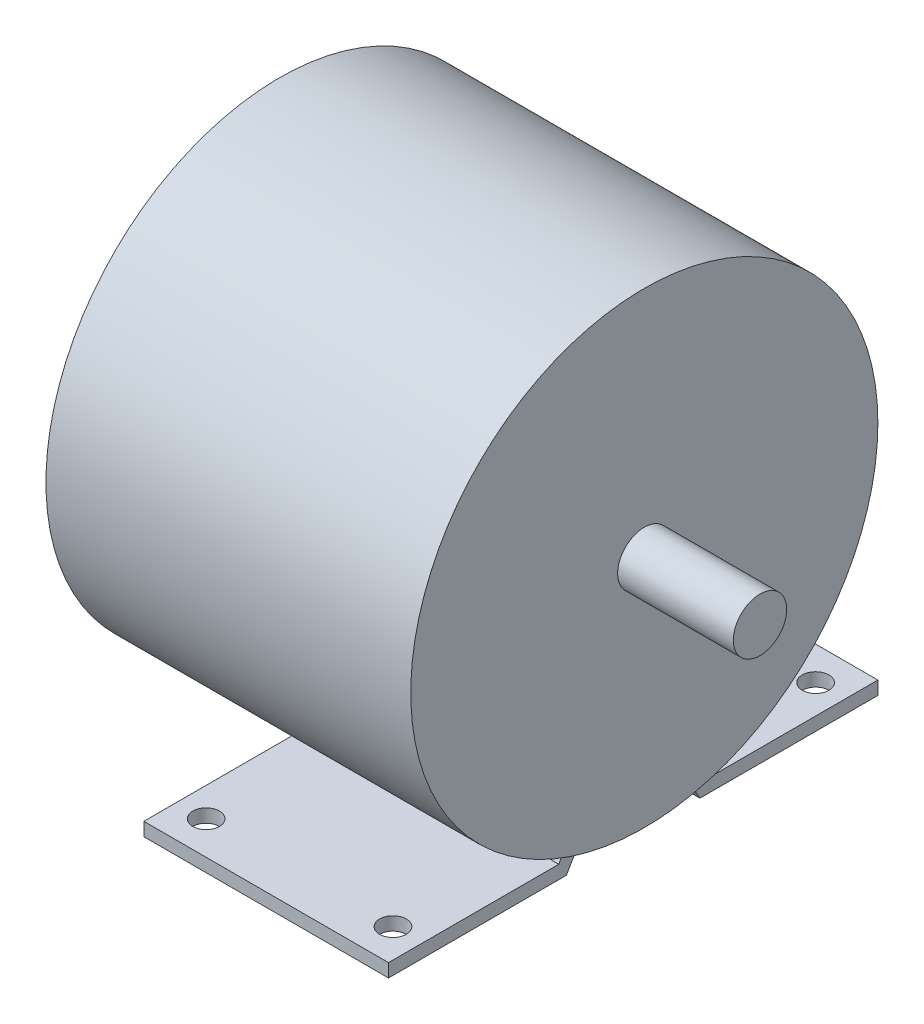
ISO-10303-21;
HEADER;
FILE_DESCRIPTION(('STEP AP214'),'2;1');
FILE_NAME('part.step','',(''),(''),'','','');
FILE_SCHEMA(('AUTOMOTIVE_DESIGN { 1 0 10303 214 1 1 1 1 }'));
ENDSEC;
DATA;
#1=APPLICATION_CONTEXT('core data for automotive mechanical design processes');
#2=APPLICATION_PROTOCOL_DEFINITION('international standard','automotive_design',2000,#1);
#3=PRODUCT_CONTEXT('',#1,'mechanical');
#4=PRODUCT('Part','Part','',(#3));
#5=PRODUCT_RELATED_PRODUCT_CATEGORY('part','',(#4));
#6=PRODUCT_DEFINITION_FORMATION('','',#4);
#7=PRODUCT_DEFINITION_CONTEXT('part definition',#1,'design');
#8=PRODUCT_DEFINITION('design','',#6,#7);
#9=PRODUCT_DEFINITION_SHAPE('','',#8);
#10=(LENGTH_UNIT() NAMED_UNIT(*) SI_UNIT(.MILLI.,.METRE.));
#11=(NAMED_UNIT(*) PLANE_ANGLE_UNIT() SI_UNIT($,.RADIAN.));
#12=(NAMED_UNIT(*) SI_UNIT($,.STERADIAN.) SOLID_ANGLE_UNIT());
#13=UNCERTAINTY_MEASURE_WITH_UNIT(LENGTH_MEASURE(1.E-05),#10,'distance_accuracy_value','');
#14=(GEOMETRIC_REPRESENTATION_CONTEXT(3) GLOBAL_UNCERTAINTY_ASSIGNED_CONTEXT((#13)) GLOBAL_UNIT_ASSIGNED_CONTEXT((#10,
#11,#12)) REPRESENTATION_CONTEXT('',''));
#15=CARTESIAN_POINT('',(0.,0.,0.));
#16=DIRECTION('',(0.,0.,1.));
#17=DIRECTION('',(1.,0.,0.));
#18=AXIS2_PLACEMENT_3D('',#15,#16,#17);
#19=CARTESIAN_POINT('',(82.,0.,0.));
#20=DIRECTION('',(-1.,0.,0.));
#21=DIRECTION('',(0.,0.,1.));
#22=AXIS2_PLACEMENT_3D('',#19,#20,#21);
#23=CYLINDRICAL_SURFACE('',#22,52.5);
#24=DIRECTION('',(1.,0.,0.));
#25=VECTOR('',#24,1.);
#26=CARTESIAN_POINT('',(24.5,-50.1908805682677,-15.3988800820673));
#27=LINE('',#26,#25);
#28=CARTESIAN_POINT('',(24.5,-50.1908805682677,-15.3988800820673));
#29=VERTEX_POINT('',#28);
#30=CARTESIAN_POINT('',(79.5,-50.1908805682677,-15.3988800820672));
#31=VERTEX_POINT('',#30);
#32=EDGE_CURVE('E62',#29,#31,#27,.T.);
#33=ORIENTED_EDGE('',*,*,#32,.F.);
#34=CARTESIAN_POINT('',(24.5,0.,0.));
#35=DIRECTION('',(-1.,0.,0.));
#36=DIRECTION('',(0.,0.,1.));
#37=AXIS2_PLACEMENT_3D('',#34,#35,#36);
#38=CIRCLE('',#37,52.5);
#39=CARTESIAN_POINT('',(24.5,-51.0123974820466,-12.4090814782436));
#40=VERTEX_POINT('',#39);
#41=EDGE_CURVE('E66',#29,#40,#38,.T.);
#42=ORIENTED_EDGE('',*,*,#41,.T.);
#43=DIRECTION('',(1.,0.,0.));
#44=VECTOR('',#43,1.);
#45=CARTESIAN_POINT('',(24.5,-51.0123974820466,-12.4090814782436));
#46=LINE('',#45,#44);
#47=CARTESIAN_POINT('',(79.5,-51.0123974820466,-12.4090814782436));
#48=VERTEX_POINT('',#47);
#49=EDGE_CURVE('E145',#40,#48,#46,.T.);
#50=ORIENTED_EDGE('',*,*,#49,.T.);
#51=CARTESIAN_POINT('',(79.5,0.,0.));
#52=DIRECTION('',(-1.,0.,0.));
#53=DIRECTION('',(0.,0.,1.));
#54=AXIS2_PLACEMENT_3D('',#51,#52,#53);
#55=CIRCLE('',#54,52.5);
#56=EDGE_CURVE('E169',#31,#48,#55,.T.);
#57=ORIENTED_EDGE('',*,*,#56,.F.);
#58=EDGE_LOOP('',(#33,#42,#50,#57));
#59=FACE_BOUND('',#58,.T.);
#60=CARTESIAN_POINT('',(0.,0.,0.));
#61=DIRECTION('',(1.,0.,0.));
#62=DIRECTION('',(0.,0.,-1.));
#63=AXIS2_PLACEMENT_3D('',#60,#61,#62);
#64=CIRCLE('',#63,52.5);
#65=CARTESIAN_POINT('',(0.,0.,-52.5));
#66=VERTEX_POINT('',#65);
#67=EDGE_CURVE('E51',#66,#66,#64,.T.);
#68=ORIENTED_EDGE('',*,*,#67,.T.);
#69=EDGE_LOOP('',(#68));
#70=FACE_BOUND('',#69,.T.);
#71=CARTESIAN_POINT('',(82.,0.,0.));
#72=DIRECTION('',(1.,0.,0.));
#73=DIRECTION('',(0.,0.,-1.));
#74=AXIS2_PLACEMENT_3D('',#71,#72,#73);
#75=CIRCLE('',#74,52.5);
#76=CARTESIAN_POINT('',(82.,0.,-52.5));
#77=VERTEX_POINT('',#76);
#78=EDGE_CURVE('E13',#77,#77,#75,.T.);
#79=ORIENTED_EDGE('',*,*,#78,.F.);
#80=EDGE_LOOP('',(#79));
#81=FACE_BOUND('',#80,.T.);
#82=CARTESIAN_POINT('',(24.5,0.,0.));
#83=DIRECTION('',(-1.,0.,0.));
#84=DIRECTION('',(0.,0.,-1.));
#85=AXIS2_PLACEMENT_3D('',#82,#83,#84);
#86=CIRCLE('',#85,52.5);
#87=CARTESIAN_POINT('',(24.5,-51.0123974820466,12.4090814782436));
#88=VERTEX_POINT('',#87);
#89=CARTESIAN_POINT('',(24.5,-50.1908805682677,15.3988800820672));
#90=VERTEX_POINT('',#89);
#91=EDGE_CURVE('E207',#88,#90,#86,.T.);
#92=ORIENTED_EDGE('',*,*,#91,.T.);
#93=DIRECTION('',(1.,0.,0.));
#94=VECTOR('',#93,1.);
#95=CARTESIAN_POINT('',(24.5,-50.1908805682677,15.3988800820672));
#96=LINE('',#95,#94);
#97=CARTESIAN_POINT('',(79.5,-50.1908805682677,15.3988800820672));
#98=VERTEX_POINT('',#97);
#99=EDGE_CURVE('E226',#90,#98,#96,.T.);
#100=ORIENTED_EDGE('',*,*,#99,.T.);
#101=CARTESIAN_POINT('',(79.5,0.,0.));
#102=DIRECTION('',(-1.,0.,0.));
#103=DIRECTION('',(0.,0.,-1.));
#104=AXIS2_PLACEMENT_3D('',#101,#102,#103);
#105=CIRCLE('',#104,52.5);
#106=CARTESIAN_POINT('',(79.5,-51.0123974820466,12.4090814782436));
#107=VERTEX_POINT('',#106);
#108=EDGE_CURVE('E196',#107,#98,#105,.T.);
#109=ORIENTED_EDGE('',*,*,#108,.F.);
#110=DIRECTION('',(1.,0.,0.));
#111=VECTOR('',#110,1.);
#112=CARTESIAN_POINT('',(24.5,-51.0123974820466,12.4090814782436));
#113=LINE('',#112,#111);
#114=EDGE_CURVE('E230',#88,#107,#113,.T.);
#115=ORIENTED_EDGE('',*,*,#114,.F.);
#116=EDGE_LOOP('',(#92,#100,#109,#115));
#117=FACE_BOUND('',#116,.T.);
#118=ADVANCED_FACE('F48',(#59,#70,#81,#117),#23,.T.);
#119=CARTESIAN_POINT('',(82.,0.,0.));
#120=DIRECTION('',(1.,0.,0.));
#121=DIRECTION('',(0.,0.,-1.));
#122=AXIS2_PLACEMENT_3D('',#119,#120,#121);
#123=PLANE('',#122);
#124=CARTESIAN_POINT('',(82.,0.,0.));
#125=DIRECTION('',(1.,0.,0.));
#126=DIRECTION('',(0.,0.,-1.));
#127=AXIS2_PLACEMENT_3D('',#124,#125,#126);
#128=CIRCLE('',#127,6.);
#129=CARTESIAN_POINT('',(82.,0.,6.));
#130=VERTEX_POINT('',#129);
#131=EDGE_CURVE('E229',#130,#130,#128,.T.);
#132=ORIENTED_EDGE('',*,*,#131,.F.);
#133=EDGE_LOOP('',(#132));
#134=FACE_BOUND('',#133,.T.);
#135=ORIENTED_EDGE('',*,*,#78,.T.);
#136=EDGE_LOOP('',(#135));
#137=FACE_BOUND('',#136,.T.);
#138=ADVANCED_FACE('F248',(#134,#137),#123,.T.);
#139=CARTESIAN_POINT('',(0.,0.,0.));
#140=DIRECTION('',(1.,0.,0.));
#141=DIRECTION('',(0.,0.,-1.));
#142=AXIS2_PLACEMENT_3D('',#139,#140,#141);
#143=PLANE('',#142);
#144=ORIENTED_EDGE('',*,*,#67,.F.);
#145=EDGE_LOOP('',(#144));
#146=FACE_BOUND('',#145,.T.);
#147=ADVANCED_FACE('F251',(#146),#143,.F.);
#148=CARTESIAN_POINT('',(108.,0.,0.));
#149=DIRECTION('',(-1.,0.,0.));
#150=DIRECTION('',(0.,0.,1.));
#151=AXIS2_PLACEMENT_3D('',#148,#149,#150);
#152=CYLINDRICAL_SURFACE('',#151,6.);
#153=CARTESIAN_POINT('',(108.,0.,0.));
#154=DIRECTION('',(1.,0.,0.));
#155=DIRECTION('',(0.,0.,-1.));
#156=AXIS2_PLACEMENT_3D('',#153,#154,#155);
#157=CIRCLE('',#156,6.);
#158=CARTESIAN_POINT('',(108.,0.,6.));
#159=VERTEX_POINT('',#158);
#160=EDGE_CURVE('E240',#159,#159,#157,.T.);
#161=CARTESIAN_POINT('',(108.,0.,6.));
#162=CARTESIAN_POINT('',(107.729166666667,0.,6.));
#163=CARTESIAN_POINT('',(107.458333333333,0.,6.));
#164=CARTESIAN_POINT('',(106.916666666667,0.,6.));
#165=CARTESIAN_POINT('',(106.645833333333,0.,6.));
#166=CARTESIAN_POINT('',(106.104166666667,0.,6.));
#167=CARTESIAN_POINT('',(105.833333333333,0.,6.));
#168=CARTESIAN_POINT('',(105.291666666667,0.,6.));
#169=CARTESIAN_POINT('',(105.020833333333,0.,6.));
#170=CARTESIAN_POINT('',(104.479166666667,0.,6.));
#171=CARTESIAN_POINT('',(104.208333333333,0.,6.));
#172=CARTESIAN_POINT('',(103.666666666667,0.,6.));
#173=CARTESIAN_POINT('',(103.395833333333,0.,6.));
#174=CARTESIAN_POINT('',(102.854166666667,0.,6.));
#175=CARTESIAN_POINT('',(102.583333333333,0.,6.));
#176=CARTESIAN_POINT('',(102.041666666667,0.,6.));
#177=CARTESIAN_POINT('',(101.770833333333,0.,6.));
#178=CARTESIAN_POINT('',(101.229166666667,0.,6.));
#179=CARTESIAN_POINT('',(100.958333333333,0.,6.));
#180=CARTESIAN_POINT('',(100.416666666667,0.,6.));
#181=CARTESIAN_POINT('',(100.145833333333,0.,6.));
#182=CARTESIAN_POINT('',(99.6041666666667,0.,6.));
#183=CARTESIAN_POINT('',(99.3333333333333,0.,6.));
#184=CARTESIAN_POINT('',(98.7916666666667,0.,6.));
#185=CARTESIAN_POINT('',(98.5208333333333,0.,6.));
#186=CARTESIAN_POINT('',(97.9791666666667,0.,6.));
#187=CARTESIAN_POINT('',(97.7083333333333,0.,6.));
#188=CARTESIAN_POINT('',(97.1666666666667,0.,6.));
#189=CARTESIAN_POINT('',(96.8958333333333,0.,6.));
#190=CARTESIAN_POINT('',(96.3541666666667,0.,6.));
#191=CARTESIAN_POINT('',(96.0833333333333,0.,6.));
#192=CARTESIAN_POINT('',(95.5416666666667,0.,6.));
#193=CARTESIAN_POINT('',(95.2708333333333,0.,6.));
#194=CARTESIAN_POINT('',(94.7291666666667,0.,6.));
#195=CARTESIAN_POINT('',(94.4583333333333,0.,6.));
#196=CARTESIAN_POINT('',(93.9166666666667,0.,6.));
#197=CARTESIAN_POINT('',(93.6458333333333,0.,6.));
#198=CARTESIAN_POINT('',(93.1041666666667,0.,6.));
#199=CARTESIAN_POINT('',(92.8333333333333,0.,6.));
#200=CARTESIAN_POINT('',(92.2916666666667,0.,6.));
#201=CARTESIAN_POINT('',(92.0208333333333,0.,6.));
#202=CARTESIAN_POINT('',(91.4791666666667,0.,6.));
#203=CARTESIAN_POINT('',(91.2083333333333,0.,6.));
#204=CARTESIAN_POINT('',(90.6666666666667,0.,6.));
#205=CARTESIAN_POINT('',(90.3958333333333,0.,6.));
#206=CARTESIAN_POINT('',(89.8541666666667,0.,6.));
#207=CARTESIAN_POINT('',(89.5833333333333,0.,6.));
#208=CARTESIAN_POINT('',(89.0416666666667,0.,6.));
#209=CARTESIAN_POINT('',(88.7708333333333,0.,6.));
#210=CARTESIAN_POINT('',(88.2291666666667,0.,6.));
#211=CARTESIAN_POINT('',(87.9583333333333,0.,6.));
#212=CARTESIAN_POINT('',(87.4166666666667,0.,6.));
#213=CARTESIAN_POINT('',(87.1458333333333,0.,6.));
#214=CARTESIAN_POINT('',(86.6041666666667,0.,6.));
#215=CARTESIAN_POINT('',(86.3333333333333,0.,6.));
#216=CARTESIAN_POINT('',(85.7916666666667,0.,6.));
#217=CARTESIAN_POINT('',(85.5208333333333,0.,6.));
#218=CARTESIAN_POINT('',(84.9791666666667,0.,6.));
#219=CARTESIAN_POINT('',(84.7083333333333,0.,6.));
#220=CARTESIAN_POINT('',(84.1666666666667,0.,6.));
#221=CARTESIAN_POINT('',(83.8958333333333,0.,6.));
#222=CARTESIAN_POINT('',(83.3541666666667,0.,6.));
#223=CARTESIAN_POINT('',(83.0833333333333,0.,6.));
#224=CARTESIAN_POINT('',(82.5416666666667,0.,6.));
#225=CARTESIAN_POINT('',(82.2708333333333,0.,6.));
#226=CARTESIAN_POINT('',(82.,0.,6.));
#227=B_SPLINE_CURVE_WITH_KNOTS('',3,(#161,#162,#163,#164,#165,#166,#167,#168,#169,#170,#171,
#172,#173,#174,#175,#176,#177,#178,#179,#180,#181,#182,#183,#184,#185,#186,#187,#188,#189,#190,
#191,#192,#193,#194,#195,#196,#197,#198,#199,#200,#201,#202,#203,#204,#205,#206,#207,#208,#209,
#210,#211,#212,#213,#214,#215,#216,#217,#218,#219,#220,#221,#222,#223,#224,#225,#226),
.UNSPECIFIED.,.F.,.F.,(4,2,2,2,2,2,2,2,2,2,2,2,2,2,2,2,2,2,2,2,2,2,2,2,2,2,2,2,2,2,2,2,4),(0.,
0.812500000000008,1.625,2.43750000000001,3.25,4.06250000000001,4.875,5.6875,6.50000000000001,
7.3125,8.12500000000001,8.9375,9.75000000000001,10.5625,11.375,12.1875,13.,13.8125,14.625,
15.4375,16.25,17.0625,17.875,18.6875,19.5,20.3125,21.125,21.9375,22.75,23.5625,24.375,25.1875,
26.),.UNSPECIFIED.);
#228=EDGE_CURVE('BSEAM246',#159,#130,#227,.T.);
#229=ORIENTED_EDGE('',*,*,#160,.F.);
#230=ORIENTED_EDGE('',*,*,#131,.T.);
#231=ORIENTED_EDGE('',*,*,#228,.T.);
#232=ORIENTED_EDGE('',*,*,#228,.F.);
#233=EDGE_LOOP('',(#229,#231,#230,#232));
#234=FACE_BOUND('',#233,.T.);
#235=ADVANCED_FACE('F246',(#234),#152,.T.);
#236=CARTESIAN_POINT('',(108.,0.,0.));
#237=DIRECTION('',(1.,0.,0.));
#238=DIRECTION('',(0.,0.,-1.));
#239=AXIS2_PLACEMENT_3D('',#236,#237,#238);
#240=PLANE('',#239);
#241=ORIENTED_EDGE('',*,*,#160,.T.);
#242=EDGE_LOOP('',(#241));
#243=FACE_BOUND('',#242,.T.);
#244=ADVANCED_FACE('F298',(#243),#240,.T.);
#245=CARTESIAN_POINT('',(24.5,-52.5,16.7320508075689));
#246=DIRECTION('',(0.,0.5,0.866025403784439));
#247=DIRECTION('',(0.,-0.866025403784439,0.5));
#248=AXIS2_PLACEMENT_3D('',#245,#246,#247);
#249=PLANE('',#248);
#250=DIRECTION('',(0.,-0.866025403784438,0.5));
#251=VECTOR('',#250,1.);
#252=CARTESIAN_POINT('',(79.5,-52.5,16.7320508075689));
#253=LINE('',#252,#251);
#254=CARTESIAN_POINT('',(79.5,-52.5,16.7320508075689));
#255=VERTEX_POINT('',#254);
#256=EDGE_CURVE('E185',#98,#255,#253,.T.);
#257=ORIENTED_EDGE('',*,*,#256,.F.);
#258=ORIENTED_EDGE('',*,*,#99,.F.);
#259=DIRECTION('',(0.,-0.866025403784438,0.5));
#260=VECTOR('',#259,1.);
#261=CARTESIAN_POINT('',(24.5,-52.5,16.7320508075689));
#262=LINE('',#261,#260);
#263=CARTESIAN_POINT('',(24.5,-52.5,16.7320508075689));
#264=VERTEX_POINT('',#263);
#265=EDGE_CURVE('E192',#90,#264,#262,.T.);
#266=ORIENTED_EDGE('',*,*,#265,.T.);
#267=DIRECTION('',(1.,0.,0.));
#268=VECTOR('',#267,1.);
#269=CARTESIAN_POINT('',(24.5,-52.5,16.7320508075689));
#270=LINE('',#269,#268);
#271=EDGE_CURVE('E210',#264,#255,#270,.T.);
#272=ORIENTED_EDGE('',*,*,#271,.T.);
#273=EDGE_LOOP('',(#257,#258,#266,#272));
#274=FACE_BOUND('',#273,.T.);
#275=ADVANCED_FACE('F268',(#274),#249,.T.);
#276=CARTESIAN_POINT('',(24.5,-55.5,15.));
#277=DIRECTION('',(0.,-0.499999999999998,-0.86602540378444));
#278=DIRECTION('',(0.,0.86602540378444,-0.499999999999998));
#279=AXIS2_PLACEMENT_3D('',#276,#277,#278);
#280=PLANE('',#279);
#281=DIRECTION('',(0.,0.86602540378444,-0.499999999999998));
#282=VECTOR('',#281,1.);
#283=CARTESIAN_POINT('',(79.5,-55.5,15.));
#284=LINE('',#283,#282);
#285=CARTESIAN_POINT('',(79.5,-55.5,15.));
#286=VERTEX_POINT('',#285);
#287=EDGE_CURVE('E222',#286,#107,#284,.T.);
#288=ORIENTED_EDGE('',*,*,#287,.F.);
#289=DIRECTION('',(1.,0.,0.));
#290=VECTOR('',#289,1.);
#291=CARTESIAN_POINT('',(24.5,-55.5,15.));
#292=LINE('',#291,#290);
#293=CARTESIAN_POINT('',(24.5,-55.5,15.));
#294=VERTEX_POINT('',#293);
#295=EDGE_CURVE('E233',#294,#286,#292,.T.);
#296=ORIENTED_EDGE('',*,*,#295,.F.);
#297=DIRECTION('',(0.,0.86602540378444,-0.499999999999998));
#298=VECTOR('',#297,1.);
#299=CARTESIAN_POINT('',(24.5,-55.5,15.));
#300=LINE('',#299,#298);
#301=EDGE_CURVE('E205',#294,#88,#300,.T.);
#302=ORIENTED_EDGE('',*,*,#301,.T.);
#303=ORIENTED_EDGE('',*,*,#114,.T.);
#304=EDGE_LOOP('',(#288,#296,#302,#303));
#305=FACE_BOUND('',#304,.T.);
#306=ADVANCED_FACE('F275',(#305),#280,.T.);
#307=CARTESIAN_POINT('',(24.5,-55.5,55.));
#308=DIRECTION('',(0.,-1.,0.));
#309=DIRECTION('',(0.,0.,-1.));
#310=AXIS2_PLACEMENT_3D('',#307,#308,#309);
#311=PLANE('',#310);
#312=CARTESIAN_POINT('',(31.,-55.5,47.4999999999997));
#313=DIRECTION('',(0.,-1.,0.));
#314=DIRECTION('',(0.,0.,-1.));
#315=AXIS2_PLACEMENT_3D('',#312,#313,#314);
#316=CIRCLE('',#315,3.00000000000001);
#317=CARTESIAN_POINT('',(31.,-55.5,44.4999999999997));
#318=VERTEX_POINT('',#317);
#319=EDGE_CURVE('E471',#318,#318,#316,.T.);
#320=ORIENTED_EDGE('',*,*,#319,.F.);
#321=EDGE_LOOP('',(#320));
#322=FACE_BOUND('',#321,.T.);
#323=CARTESIAN_POINT('',(73.,-55.5,47.5));
#324=DIRECTION('',(0.,-1.,0.));
#325=DIRECTION('',(0.,0.,-1.));
#326=AXIS2_PLACEMENT_3D('',#323,#324,#325);
#327=CIRCLE('',#326,3.00000000000001);
#328=CARTESIAN_POINT('',(73.,-55.5,44.5));
#329=VERTEX_POINT('',#328);
#330=EDGE_CURVE('E477',#329,#329,#327,.T.);
#331=ORIENTED_EDGE('',*,*,#330,.F.);
#332=EDGE_LOOP('',(#331));
#333=FACE_BOUND('',#332,.T.);
#334=DIRECTION('',(0.,0.,-1.));
#335=VECTOR('',#334,1.);
#336=CARTESIAN_POINT('',(79.5,-55.5,55.));
#337=LINE('',#336,#335);
#338=CARTESIAN_POINT('',(79.5,-55.5,55.));
#339=VERTEX_POINT('',#338);
#340=EDGE_CURVE('E219',#339,#286,#337,.T.);
#341=ORIENTED_EDGE('',*,*,#340,.F.);
#342=DIRECTION('',(1.,0.,0.));
#343=VECTOR('',#342,1.);
#344=CARTESIAN_POINT('',(24.5,-55.5,55.));
#345=LINE('',#344,#343);
#346=CARTESIAN_POINT('',(24.5,-55.5,55.));
#347=VERTEX_POINT('',#346);
#348=EDGE_CURVE('E235',#347,#339,#345,.T.);
#349=ORIENTED_EDGE('',*,*,#348,.F.);
#350=DIRECTION('',(0.,0.,-1.));
#351=VECTOR('',#350,1.);
#352=CARTESIAN_POINT('',(24.5,-55.5,55.));
#353=LINE('',#352,#351);
#354=EDGE_CURVE('E202',#347,#294,#353,.T.);
#355=ORIENTED_EDGE('',*,*,#354,.T.);
#356=ORIENTED_EDGE('',*,*,#295,.T.);
#357=EDGE_LOOP('',(#341,#349,#355,#356));
#358=FACE_BOUND('',#357,.T.);
#359=ADVANCED_FACE('F277',(#322,#333,#358),#311,.T.);
#360=CARTESIAN_POINT('',(24.5,-52.5,55.));
#361=DIRECTION('',(0.,0.,1.));
#362=DIRECTION('',(1.,0.,0.));
#363=AXIS2_PLACEMENT_3D('',#360,#361,#362);
#364=PLANE('',#363);
#365=DIRECTION('',(0.,-1.,0.));
#366=VECTOR('',#365,1.);
#367=CARTESIAN_POINT('',(79.5,-52.5,55.));
#368=LINE('',#367,#366);
#369=CARTESIAN_POINT('',(79.5,-52.5,55.));
#370=VERTEX_POINT('',#369);
#371=EDGE_CURVE('E216',#370,#339,#368,.T.);
#372=ORIENTED_EDGE('',*,*,#371,.F.);
#373=DIRECTION('',(1.,0.,0.));
#374=VECTOR('',#373,1.);
#375=CARTESIAN_POINT('',(24.5,-52.5,55.));
#376=LINE('',#375,#374);
#377=CARTESIAN_POINT('',(24.5,-52.5,55.));
#378=VERTEX_POINT('',#377);
#379=EDGE_CURVE('E237',#378,#370,#376,.T.);
#380=ORIENTED_EDGE('',*,*,#379,.F.);
#381=DIRECTION('',(0.,-1.,0.));
#382=VECTOR('',#381,1.);
#383=CARTESIAN_POINT('',(24.5,-52.5,55.));
#384=LINE('',#383,#382);
#385=EDGE_CURVE('E199',#378,#347,#384,.T.);
#386=ORIENTED_EDGE('',*,*,#385,.T.);
#387=ORIENTED_EDGE('',*,*,#348,.T.);
#388=EDGE_LOOP('',(#372,#380,#386,#387));
#389=FACE_BOUND('',#388,.T.);
#390=ADVANCED_FACE('F280',(#389),#364,.T.);
#391=CARTESIAN_POINT('',(24.5,-52.5,55.));
#392=DIRECTION('',(0.,1.,0.));
#393=DIRECTION('',(0.,0.,1.));
#394=AXIS2_PLACEMENT_3D('',#391,#392,#393);
#395=PLANE('',#394);
#396=CARTESIAN_POINT('',(31.,-52.5,47.4999999999997));
#397=DIRECTION('',(0.,1.,0.));
#398=DIRECTION('',(0.,0.,1.));
#399=AXIS2_PLACEMENT_3D('',#396,#397,#398);
#400=CIRCLE('',#399,3.00000000000001);
#401=CARTESIAN_POINT('',(31.,-52.5,50.4999999999997));
#402=VERTEX_POINT('',#401);
#403=EDGE_CURVE('E479',#402,#402,#400,.F.);
#404=ORIENTED_EDGE('',*,*,#403,.T.);
#405=EDGE_LOOP('',(#404));
#406=FACE_BOUND('',#405,.T.);
#407=CARTESIAN_POINT('',(73.,-52.5,47.5));
#408=DIRECTION('',(0.,1.,0.));
#409=DIRECTION('',(0.,0.,1.));
#410=AXIS2_PLACEMENT_3D('',#407,#408,#409);
#411=CIRCLE('',#410,3.00000000000001);
#412=CARTESIAN_POINT('',(73.,-52.5,50.5));
#413=VERTEX_POINT('',#412);
#414=EDGE_CURVE('E173',#413,#413,#411,.F.);
#415=ORIENTED_EDGE('',*,*,#414,.T.);
#416=EDGE_LOOP('',(#415));
#417=FACE_BOUND('',#416,.T.);
#418=DIRECTION('',(0.,0.,1.));
#419=VECTOR('',#418,1.);
#420=CARTESIAN_POINT('',(79.5,-52.5,55.));
#421=LINE('',#420,#419);
#422=EDGE_CURVE('E213',#255,#370,#421,.T.);
#423=ORIENTED_EDGE('',*,*,#422,.F.);
#424=ORIENTED_EDGE('',*,*,#271,.F.);
#425=DIRECTION('',(0.,0.,1.));
#426=VECTOR('',#425,1.);
#427=CARTESIAN_POINT('',(24.5,-52.5,55.));
#428=LINE('',#427,#426);
#429=EDGE_CURVE('E195',#264,#378,#428,.T.);
#430=ORIENTED_EDGE('',*,*,#429,.T.);
#431=ORIENTED_EDGE('',*,*,#379,.T.);
#432=EDGE_LOOP('',(#423,#424,#430,#431));
#433=FACE_BOUND('',#432,.T.);
#434=ADVANCED_FACE('F282',(#406,#417,#433),#395,.T.);
#435=CARTESIAN_POINT('',(24.5,0.,0.));
#436=DIRECTION('',(1.,0.,0.));
#437=DIRECTION('',(0.,0.,-1.));
#438=AXIS2_PLACEMENT_3D('',#435,#436,#437);
#439=PLANE('',#438);
#440=ORIENTED_EDGE('',*,*,#265,.F.);
#441=ORIENTED_EDGE('',*,*,#91,.F.);
#442=ORIENTED_EDGE('',*,*,#301,.F.);
#443=ORIENTED_EDGE('',*,*,#354,.F.);
#444=ORIENTED_EDGE('',*,*,#385,.F.);
#445=ORIENTED_EDGE('',*,*,#429,.F.);
#446=EDGE_LOOP('',(#440,#441,#442,#443,#444,#445));
#447=FACE_BOUND('',#446,.T.);
#448=ADVANCED_FACE('F263',(#447),#439,.F.);
#449=CARTESIAN_POINT('',(79.5,0.,0.));
#450=DIRECTION('',(1.,0.,0.));
#451=DIRECTION('',(0.,0.,-1.));
#452=AXIS2_PLACEMENT_3D('',#449,#450,#451);
#453=PLANE('',#452);
#454=ORIENTED_EDGE('',*,*,#256,.T.);
#455=ORIENTED_EDGE('',*,*,#422,.T.);
#456=ORIENTED_EDGE('',*,*,#371,.T.);
#457=ORIENTED_EDGE('',*,*,#340,.T.);
#458=ORIENTED_EDGE('',*,*,#287,.T.);
#459=ORIENTED_EDGE('',*,*,#108,.T.);
#460=EDGE_LOOP('',(#454,#455,#456,#457,#458,#459));
#461=FACE_BOUND('',#460,.T.);
#462=ADVANCED_FACE('F271',(#461),#453,.T.);
#463=CARTESIAN_POINT('',(24.5,-52.5,-16.7320508075689));
#464=DIRECTION('',(0.,0.5,-0.866025403784439));
#465=DIRECTION('',(0.,0.866025403784439,0.5));
#466=AXIS2_PLACEMENT_3D('',#463,#464,#465);
#467=PLANE('',#466);
#468=DIRECTION('',(0.,0.866025403784439,0.5));
#469=VECTOR('',#468,1.);
#470=CARTESIAN_POINT('',(79.5,-52.5,-16.7320508075689));
#471=LINE('',#470,#469);
#472=CARTESIAN_POINT('',(79.5,-52.5,-16.7320508075689));
#473=VERTEX_POINT('',#472);
#474=EDGE_CURVE('E158',#473,#31,#471,.T.);
#475=ORIENTED_EDGE('',*,*,#474,.F.);
#476=DIRECTION('',(1.,0.,0.));
#477=VECTOR('',#476,1.);
#478=CARTESIAN_POINT('',(24.5,-52.5,-16.7320508075689));
#479=LINE('',#478,#477);
#480=CARTESIAN_POINT('',(24.5,-52.5,-16.7320508075689));
#481=VERTEX_POINT('',#480);
#482=EDGE_CURVE('E186',#481,#473,#479,.T.);
#483=ORIENTED_EDGE('',*,*,#482,.F.);
#484=DIRECTION('',(0.,0.866025403784439,0.5));
#485=VECTOR('',#484,1.);
#486=CARTESIAN_POINT('',(24.5,-52.5,-16.7320508075689));
#487=LINE('',#486,#485);
#488=EDGE_CURVE('E166',#481,#29,#487,.T.);
#489=ORIENTED_EDGE('',*,*,#488,.T.);
#490=ORIENTED_EDGE('',*,*,#32,.T.);
#491=EDGE_LOOP('',(#475,#483,#489,#490));
#492=FACE_BOUND('',#491,.T.);
#493=ADVANCED_FACE('F359',(#492),#467,.T.);
#494=CARTESIAN_POINT('',(24.5,-52.5,-55.));
#495=DIRECTION('',(0.,1.,0.));
#496=DIRECTION('',(0.,0.,1.));
#497=AXIS2_PLACEMENT_3D('',#494,#495,#496);
#498=PLANE('',#497);
#499=CARTESIAN_POINT('',(73.,-52.5,-47.5));
#500=DIRECTION('',(0.,1.,0.));
#501=DIRECTION('',(0.,0.,1.));
#502=AXIS2_PLACEMENT_3D('',#499,#500,#501);
#503=CIRCLE('',#502,3.00000000000001);
#504=CARTESIAN_POINT('',(73.,-52.5,-44.5));
#505=VERTEX_POINT('',#504);
#506=EDGE_CURVE('E474',#505,#505,#503,.F.);
#507=ORIENTED_EDGE('',*,*,#506,.T.);
#508=EDGE_LOOP('',(#507));
#509=FACE_BOUND('',#508,.T.);
#510=CARTESIAN_POINT('',(31.,-52.5,-47.5000000000003));
#511=DIRECTION('',(0.,1.,0.));
#512=DIRECTION('',(0.,0.,1.));
#513=AXIS2_PLACEMENT_3D('',#510,#511,#512);
#514=CIRCLE('',#513,3.00000000000001);
#515=CARTESIAN_POINT('',(31.,-52.5,-44.5000000000003));
#516=VERTEX_POINT('',#515);
#517=EDGE_CURVE('E468',#516,#516,#514,.F.);
#518=ORIENTED_EDGE('',*,*,#517,.T.);
#519=EDGE_LOOP('',(#518));
#520=FACE_BOUND('',#519,.T.);
#521=DIRECTION('',(0.,0.,1.));
#522=VECTOR('',#521,1.);
#523=CARTESIAN_POINT('',(79.5,-52.5,-55.));
#524=LINE('',#523,#522);
#525=CARTESIAN_POINT('',(79.5,-52.5,-55.));
#526=VERTEX_POINT('',#525);
#527=EDGE_CURVE('E179',#526,#473,#524,.T.);
#528=ORIENTED_EDGE('',*,*,#527,.F.);
#529=DIRECTION('',(1.,0.,0.));
#530=VECTOR('',#529,1.);
#531=CARTESIAN_POINT('',(24.5,-52.5,-55.));
#532=LINE('',#531,#530);
#533=CARTESIAN_POINT('',(24.5,-52.5,-55.));
#534=VERTEX_POINT('',#533);
#535=EDGE_CURVE('E188',#534,#526,#532,.T.);
#536=ORIENTED_EDGE('',*,*,#535,.F.);
#537=DIRECTION('',(0.,0.,1.));
#538=VECTOR('',#537,1.);
#539=CARTESIAN_POINT('',(24.5,-52.5,-55.));
#540=LINE('',#539,#538);
#541=EDGE_CURVE('E163',#534,#481,#540,.T.);
#542=ORIENTED_EDGE('',*,*,#541,.T.);
#543=ORIENTED_EDGE('',*,*,#482,.T.);
#544=EDGE_LOOP('',(#528,#536,#542,#543));
#545=FACE_BOUND('',#544,.T.);
#546=ADVANCED_FACE('F368',(#509,#520,#545),#498,.T.);
#547=CARTESIAN_POINT('',(24.5,-52.5,-55.));
#548=DIRECTION('',(0.,0.,-1.));
#549=DIRECTION('',(0.,1.,0.));
#550=AXIS2_PLACEMENT_3D('',#547,#548,#549);
#551=PLANE('',#550);
#552=DIRECTION('',(0.,1.,0.));
#553=VECTOR('',#552,1.);
#554=CARTESIAN_POINT('',(79.5,-52.5,-55.));
#555=LINE('',#554,#553);
#556=CARTESIAN_POINT('',(79.5,-55.5,-55.));
#557=VERTEX_POINT('',#556);
#558=EDGE_CURVE('E176',#557,#526,#555,.T.);
#559=ORIENTED_EDGE('',*,*,#558,.F.);
#560=DIRECTION('',(1.,0.,0.));
#561=VECTOR('',#560,1.);
#562=CARTESIAN_POINT('',(24.5,-55.5,-55.));
#563=LINE('',#562,#561);
#564=CARTESIAN_POINT('',(24.5,-55.5,-55.));
#565=VERTEX_POINT('',#564);
#566=EDGE_CURVE('E144',#565,#557,#563,.T.);
#567=ORIENTED_EDGE('',*,*,#566,.F.);
#568=DIRECTION('',(0.,1.,0.));
#569=VECTOR('',#568,1.);
#570=CARTESIAN_POINT('',(24.5,-52.5,-55.));
#571=LINE('',#570,#569);
#572=EDGE_CURVE('E154',#565,#534,#571,.T.);
#573=ORIENTED_EDGE('',*,*,#572,.T.);
#574=ORIENTED_EDGE('',*,*,#535,.T.);
#575=EDGE_LOOP('',(#559,#567,#573,#574));
#576=FACE_BOUND('',#575,.T.);
#577=ADVANCED_FACE('F376',(#576),#551,.T.);
#578=CARTESIAN_POINT('',(24.5,-55.5,-55.));
#579=DIRECTION('',(0.,-1.,0.));
#580=DIRECTION('',(0.,0.,-1.));
#581=AXIS2_PLACEMENT_3D('',#578,#579,#580);
#582=PLANE('',#581);
#583=CARTESIAN_POINT('',(73.,-55.5,-47.5));
#584=DIRECTION('',(0.,-1.,0.));
#585=DIRECTION('',(0.,0.,1.));
#586=AXIS2_PLACEMENT_3D('',#583,#584,#585);
#587=CIRCLE('',#586,3.00000000000001);
#588=CARTESIAN_POINT('',(73.,-55.5,-44.5));
#589=VERTEX_POINT('',#588);
#590=EDGE_CURVE('E463',#589,#589,#587,.T.);
#591=ORIENTED_EDGE('',*,*,#590,.F.);
#592=EDGE_LOOP('',(#591));
#593=FACE_BOUND('',#592,.T.);
#594=CARTESIAN_POINT('',(31.,-55.5,-47.5000000000003));
#595=DIRECTION('',(0.,-1.,0.));
#596=DIRECTION('',(0.,0.,1.));
#597=AXIS2_PLACEMENT_3D('',#594,#595,#596);
#598=CIRCLE('',#597,3.00000000000001);
#599=CARTESIAN_POINT('',(31.,-55.5,-44.5000000000003));
#600=VERTEX_POINT('',#599);
#601=EDGE_CURVE('E466',#600,#600,#598,.T.);
#602=ORIENTED_EDGE('',*,*,#601,.F.);
#603=EDGE_LOOP('',(#602));
#604=FACE_BOUND('',#603,.T.);
#605=DIRECTION('',(0.,0.,-1.));
#606=VECTOR('',#605,1.);
#607=CARTESIAN_POINT('',(79.5,-55.5,-55.));
#608=LINE('',#607,#606);
#609=CARTESIAN_POINT('',(79.5,-55.5,-15.));
#610=VERTEX_POINT('',#609);
#611=EDGE_CURVE('E139',#610,#557,#608,.T.);
#612=ORIENTED_EDGE('',*,*,#611,.F.);
#613=DIRECTION('',(1.,0.,0.));
#614=VECTOR('',#613,1.);
#615=CARTESIAN_POINT('',(24.5,-55.5,-15.));
#616=LINE('',#615,#614);
#617=CARTESIAN_POINT('',(24.5,-55.5,-15.));
#618=VERTEX_POINT('',#617);
#619=EDGE_CURVE('E134',#618,#610,#616,.T.);
#620=ORIENTED_EDGE('',*,*,#619,.F.);
#621=DIRECTION('',(0.,0.,-1.));
#622=VECTOR('',#621,1.);
#623=CARTESIAN_POINT('',(24.5,-55.5,-55.));
#624=LINE('',#623,#622);
#625=EDGE_CURVE('E137',#618,#565,#624,.T.);
#626=ORIENTED_EDGE('',*,*,#625,.T.);
#627=ORIENTED_EDGE('',*,*,#566,.T.);
#628=EDGE_LOOP('',(#612,#620,#626,#627));
#629=FACE_BOUND('',#628,.T.);
#630=ADVANCED_FACE('F136',(#593,#604,#629),#582,.T.);
#631=CARTESIAN_POINT('',(24.5,-55.5,-15.));
#632=DIRECTION('',(0.,-0.499999999999999,0.866025403784439));
#633=DIRECTION('',(0.,-0.866025403784439,-0.499999999999999));
#634=AXIS2_PLACEMENT_3D('',#631,#632,#633);
#635=PLANE('',#634);
#636=DIRECTION('',(0.,-0.866025403784439,-0.499999999999999));
#637=VECTOR('',#636,1.);
#638=CARTESIAN_POINT('',(79.5,-55.5,-15.));
#639=LINE('',#638,#637);
#640=EDGE_CURVE('E172',#48,#610,#639,.T.);
#641=ORIENTED_EDGE('',*,*,#640,.F.);
#642=ORIENTED_EDGE('',*,*,#49,.F.);
#643=DIRECTION('',(0.,-0.866025403784439,-0.499999999999999));
#644=VECTOR('',#643,1.);
#645=CARTESIAN_POINT('',(24.5,-55.5,-15.));
#646=LINE('',#645,#644);
#647=EDGE_CURVE('E151',#40,#618,#646,.T.);
#648=ORIENTED_EDGE('',*,*,#647,.T.);
#649=ORIENTED_EDGE('',*,*,#619,.T.);
#650=EDGE_LOOP('',(#641,#642,#648,#649));
#651=FACE_BOUND('',#650,.T.);
#652=ADVANCED_FACE('F156',(#651),#635,.T.);
#653=CARTESIAN_POINT('',(24.5,0.,0.));
#654=DIRECTION('',(-1.,0.,0.));
#655=DIRECTION('',(0.,0.,1.));
#656=AXIS2_PLACEMENT_3D('',#653,#654,#655);
#657=PLANE('',#656);
#658=ORIENTED_EDGE('',*,*,#41,.F.);
#659=ORIENTED_EDGE('',*,*,#488,.F.);
#660=ORIENTED_EDGE('',*,*,#541,.F.);
#661=ORIENTED_EDGE('',*,*,#572,.F.);
#662=ORIENTED_EDGE('',*,*,#625,.F.);
#663=ORIENTED_EDGE('',*,*,#647,.F.);
#664=EDGE_LOOP('',(#658,#659,#660,#661,#662,#663));
#665=FACE_BOUND('',#664,.T.);
#666=ADVANCED_FACE('F150',(#665),#657,.T.);
#667=CARTESIAN_POINT('',(79.5,0.,0.));
#668=DIRECTION('',(-1.,0.,0.));
#669=DIRECTION('',(0.,0.,1.));
#670=AXIS2_PLACEMENT_3D('',#667,#668,#669);
#671=PLANE('',#670);
#672=ORIENTED_EDGE('',*,*,#56,.T.);
#673=ORIENTED_EDGE('',*,*,#640,.T.);
#674=ORIENTED_EDGE('',*,*,#611,.T.);
#675=ORIENTED_EDGE('',*,*,#558,.T.);
#676=ORIENTED_EDGE('',*,*,#527,.T.);
#677=ORIENTED_EDGE('',*,*,#474,.T.);
#678=EDGE_LOOP('',(#672,#673,#674,#675,#676,#677));
#679=FACE_BOUND('',#678,.T.);
#680=ADVANCED_FACE('F399',(#679),#671,.F.);
#681=CARTESIAN_POINT('',(31.,52.5010000000001,-47.5000000000003));
#682=DIRECTION('',(0.,-1.,0.));
#683=DIRECTION('',(0.,0.,-1.));
#684=AXIS2_PLACEMENT_3D('',#681,#682,#683);
#685=CYLINDRICAL_SURFACE('',#684,3.00000000000001);
#686=ORIENTED_EDGE('',*,*,#517,.F.);
#687=EDGE_LOOP('',(#686));
#688=FACE_BOUND('',#687,.T.);
#689=ORIENTED_EDGE('',*,*,#601,.T.);
#690=EDGE_LOOP('',(#689));
#691=FACE_BOUND('',#690,.T.);
#692=ADVANCED_FACE('F407',(#688,#691),#685,.F.);
#693=CARTESIAN_POINT('',(73.,52.5010000000001,-47.5));
#694=DIRECTION('',(0.,-1.,0.));
#695=DIRECTION('',(0.,0.,-1.));
#696=AXIS2_PLACEMENT_3D('',#693,#694,#695);
#697=CYLINDRICAL_SURFACE('',#696,3.00000000000001);
#698=ORIENTED_EDGE('',*,*,#506,.F.);
#699=EDGE_LOOP('',(#698));
#700=FACE_BOUND('',#699,.T.);
#701=ORIENTED_EDGE('',*,*,#590,.T.);
#702=EDGE_LOOP('',(#701));
#703=FACE_BOUND('',#702,.T.);
#704=ADVANCED_FACE('F418',(#700,#703),#697,.F.);
#705=CARTESIAN_POINT('',(73.,52.501,47.5));
#706=DIRECTION('',(0.,-1.,0.));
#707=DIRECTION('',(0.,0.,-1.));
#708=AXIS2_PLACEMENT_3D('',#705,#706,#707);
#709=CYLINDRICAL_SURFACE('',#708,3.00000000000001);
#710=ORIENTED_EDGE('',*,*,#414,.F.);
#711=EDGE_LOOP('',(#710));
#712=FACE_BOUND('',#711,.T.);
#713=ORIENTED_EDGE('',*,*,#330,.T.);
#714=EDGE_LOOP('',(#713));
#715=FACE_BOUND('',#714,.T.);
#716=ADVANCED_FACE('F426',(#712,#715),#709,.F.);
#717=CARTESIAN_POINT('',(31.,52.501,47.4999999999997));
#718=DIRECTION('',(0.,-1.,0.));
#719=DIRECTION('',(0.,0.,-1.));
#720=AXIS2_PLACEMENT_3D('',#717,#718,#719);
#721=CYLINDRICAL_SURFACE('',#720,3.00000000000001);
#722=ORIENTED_EDGE('',*,*,#403,.F.);
#723=EDGE_LOOP('',(#722));
#724=FACE_BOUND('',#723,.T.);
#725=ORIENTED_EDGE('',*,*,#319,.T.);
#726=EDGE_LOOP('',(#725));
#727=FACE_BOUND('',#726,.T.);
#728=ADVANCED_FACE('F434',(#724,#727),#721,.F.);
#729=CLOSED_SHELL('',(#118,#138,#147,#235,#244,#275,#306,#359,#390,#434,#448,#462,#493,#546,
#577,#630,#652,#666,#680,#692,#704,#716,#728));
#730=MANIFOLD_SOLID_BREP('B2',#729);
#731=ADVANCED_BREP_SHAPE_REPRESENTATION('',(#18,#730),#14);
#732=SHAPE_DEFINITION_REPRESENTATION(#9,#731);
ENDSEC;
END-ISO-10303-21;
